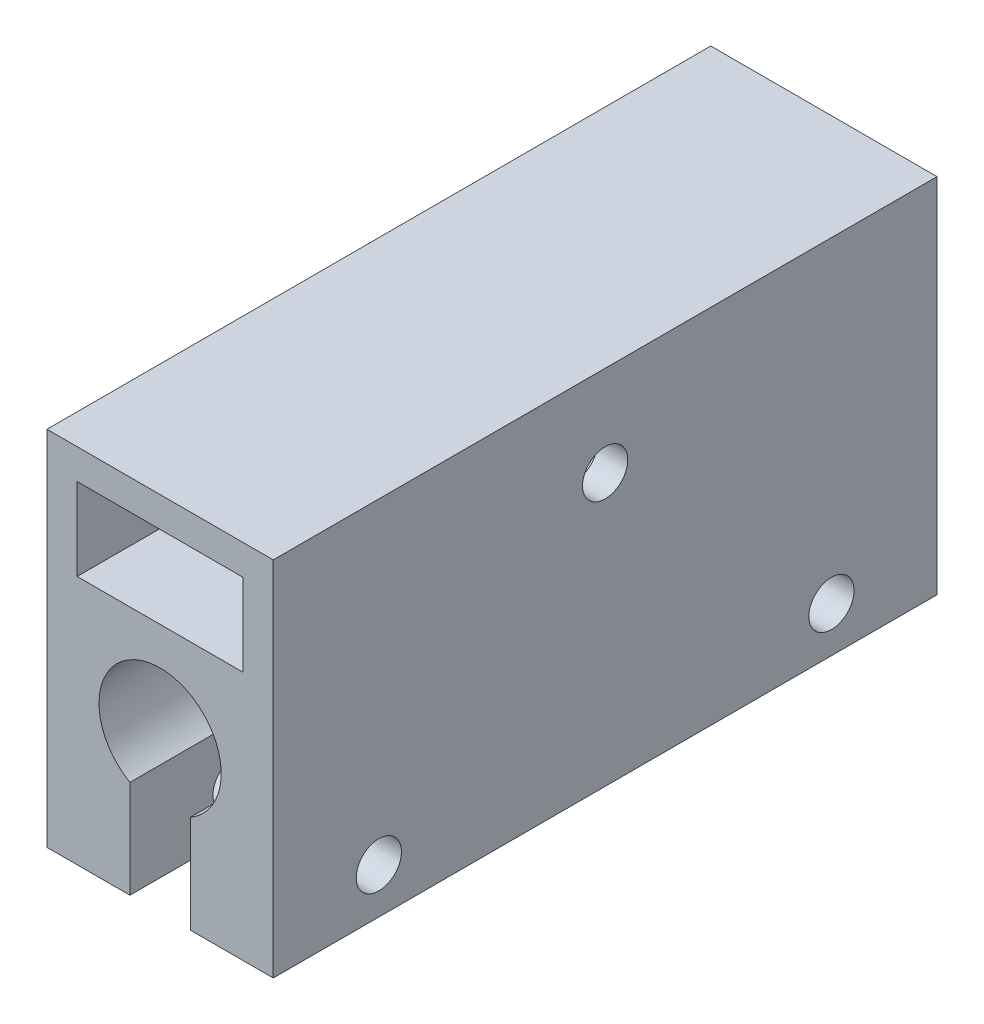
ISO-10303-21;
HEADER;
FILE_DESCRIPTION(('STEP AP214'),'2;1');
FILE_NAME('part.step','',(''),(''),'','','');
FILE_SCHEMA(('AUTOMOTIVE_DESIGN { 1 0 10303 214 1 1 1 1 }'));
ENDSEC;
DATA;
#1=APPLICATION_CONTEXT('core data for automotive mechanical design processes');
#2=APPLICATION_PROTOCOL_DEFINITION('international standard','automotive_design',2000,#1);
#3=PRODUCT_CONTEXT('',#1,'mechanical');
#4=PRODUCT('Part','Part','',(#3));
#5=PRODUCT_RELATED_PRODUCT_CATEGORY('part','',(#4));
#6=PRODUCT_DEFINITION_FORMATION('','',#4);
#7=PRODUCT_DEFINITION_CONTEXT('part definition',#1,'design');
#8=PRODUCT_DEFINITION('design','',#6,#7);
#9=PRODUCT_DEFINITION_SHAPE('','',#8);
#10=(LENGTH_UNIT() NAMED_UNIT(*) SI_UNIT(.MILLI.,.METRE.));
#11=(NAMED_UNIT(*) PLANE_ANGLE_UNIT() SI_UNIT($,.RADIAN.));
#12=(NAMED_UNIT(*) SI_UNIT($,.STERADIAN.) SOLID_ANGLE_UNIT());
#13=UNCERTAINTY_MEASURE_WITH_UNIT(LENGTH_MEASURE(1.E-05),#10,'distance_accuracy_value','');
#14=(GEOMETRIC_REPRESENTATION_CONTEXT(3) GLOBAL_UNCERTAINTY_ASSIGNED_CONTEXT((#13)) GLOBAL_UNIT_ASSIGNED_CONTEXT((#10,
#11,#12)) REPRESENTATION_CONTEXT('',''));
#15=CARTESIAN_POINT('',(0.,0.,0.));
#16=DIRECTION('',(0.,0.,1.));
#17=DIRECTION('',(1.,0.,0.));
#18=AXIS2_PLACEMENT_3D('',#15,#16,#17);
#19=CARTESIAN_POINT('',(-5.5,6.55,44.));
#20=DIRECTION('',(0.,1.,0.));
#21=DIRECTION('',(-1.,0.,0.));
#22=AXIS2_PLACEMENT_3D('',#19,#20,#21);
#23=PLANE('',#22);
#24=DIRECTION('',(-1.,0.,0.));
#25=VECTOR('',#24,1.);
#26=CARTESIAN_POINT('',(7.5,6.55,21.6159427126066));
#27=LINE('',#26,#25);
#28=CARTESIAN_POINT('',(5.5,6.55,21.6159427126066));
#29=VERTEX_POINT('',#28);
#30=CARTESIAN_POINT('',(-5.5,6.55,21.6159427126066));
#31=VERTEX_POINT('',#30);
#32=EDGE_CURVE('E11',#29,#31,#27,.T.);
#33=ORIENTED_EDGE('',*,*,#32,.F.);
#34=DIRECTION('',(0.,0.,-1.));
#35=VECTOR('',#34,1.);
#36=CARTESIAN_POINT('',(5.5,6.55,44.));
#37=LINE('',#36,#35);
#38=CARTESIAN_POINT('',(5.5,6.55,0.));
#39=VERTEX_POINT('',#38);
#40=EDGE_CURVE('E145',#29,#39,#37,.T.);
#41=ORIENTED_EDGE('',*,*,#40,.T.);
#42=DIRECTION('',(1.,0.,0.));
#43=VECTOR('',#42,1.);
#44=CARTESIAN_POINT('',(-5.5,6.55,0.));
#45=LINE('',#44,#43);
#46=CARTESIAN_POINT('',(-5.5,6.55,0.));
#47=VERTEX_POINT('',#46);
#48=EDGE_CURVE('E155',#47,#39,#45,.T.);
#49=ORIENTED_EDGE('',*,*,#48,.F.);
#50=DIRECTION('',(0.,0.,-1.));
#51=VECTOR('',#50,1.);
#52=CARTESIAN_POINT('',(-5.5,6.55,44.));
#53=LINE('',#52,#51);
#54=EDGE_CURVE('E151',#31,#47,#53,.T.);
#55=ORIENTED_EDGE('',*,*,#54,.F.);
#56=EDGE_LOOP('',(#33,#41,#49,#55));
#57=FACE_BOUND('',#56,.T.);
#58=ADVANCED_FACE('F34',(#57),#23,.T.);
#59=CARTESIAN_POINT('',(0.,0.,44.));
#60=DIRECTION('',(0.,0.,1.));
#61=DIRECTION('',(1.,0.,0.));
#62=AXIS2_PLACEMENT_3D('',#59,#60,#61);
#63=PLANE('',#62);
#64=DIRECTION('',(0.,-1.,0.));
#65=VECTOR('',#64,1.);
#66=CARTESIAN_POINT('',(-7.5,14.,44.));
#67=LINE('',#66,#65);
#68=CARTESIAN_POINT('',(-7.5,14.,44.));
#69=VERTEX_POINT('',#68);
#70=CARTESIAN_POINT('',(-7.5,-9.99999999999999,44.));
#71=VERTEX_POINT('',#70);
#72=EDGE_CURVE('E164',#69,#71,#67,.T.);
#73=ORIENTED_EDGE('',*,*,#72,.T.);
#74=DIRECTION('',(1.,0.,0.));
#75=VECTOR('',#74,1.);
#76=CARTESIAN_POINT('',(-7.5,-9.99999999999999,44.));
#77=LINE('',#76,#75);
#78=CARTESIAN_POINT('',(-2.,-10.,44.));
#79=VERTEX_POINT('',#78);
#80=EDGE_CURVE('E167',#71,#79,#77,.T.);
#81=ORIENTED_EDGE('',*,*,#80,.T.);
#82=DIRECTION('',(0.,1.,0.));
#83=VECTOR('',#82,1.);
#84=CARTESIAN_POINT('',(-2.,-3.52171833058807,44.));
#85=LINE('',#84,#83);
#86=CARTESIAN_POINT('',(-2.,-3.52171833058807,44.));
#87=VERTEX_POINT('',#86);
#88=EDGE_CURVE('E170',#79,#87,#85,.T.);
#89=ORIENTED_EDGE('',*,*,#88,.T.);
#90=CARTESIAN_POINT('',(0.,0.,44.));
#91=DIRECTION('',(0.,0.,-1.));
#92=DIRECTION('',(1.,0.,0.));
#93=AXIS2_PLACEMENT_3D('',#90,#91,#92);
#94=CIRCLE('',#93,4.05);
#95=CARTESIAN_POINT('',(2.,-3.52171833058807,44.));
#96=VERTEX_POINT('',#95);
#97=EDGE_CURVE('E172',#87,#96,#94,.T.);
#98=ORIENTED_EDGE('',*,*,#97,.T.);
#99=DIRECTION('',(0.,-1.,0.));
#100=VECTOR('',#99,1.);
#101=CARTESIAN_POINT('',(2.,-3.52171833058807,44.));
#102=LINE('',#101,#100);
#103=CARTESIAN_POINT('',(2.,-10.,44.));
#104=VERTEX_POINT('',#103);
#105=EDGE_CURVE('E174',#96,#104,#102,.T.);
#106=ORIENTED_EDGE('',*,*,#105,.T.);
#107=DIRECTION('',(1.,0.,0.));
#108=VECTOR('',#107,1.);
#109=CARTESIAN_POINT('',(2.,-10.,44.));
#110=LINE('',#109,#108);
#111=CARTESIAN_POINT('',(7.5,-9.99999999999999,44.));
#112=VERTEX_POINT('',#111);
#113=EDGE_CURVE('E176',#104,#112,#110,.T.);
#114=ORIENTED_EDGE('',*,*,#113,.T.);
#115=DIRECTION('',(0.,1.,0.));
#116=VECTOR('',#115,1.);
#117=CARTESIAN_POINT('',(7.5,14.,44.));
#118=LINE('',#117,#116);
#119=CARTESIAN_POINT('',(7.5,14.,44.));
#120=VERTEX_POINT('',#119);
#121=EDGE_CURVE('E178',#112,#120,#118,.T.);
#122=ORIENTED_EDGE('',*,*,#121,.T.);
#123=DIRECTION('',(-1.,0.,0.));
#124=VECTOR('',#123,1.);
#125=CARTESIAN_POINT('',(-7.5,14.,44.));
#126=LINE('',#125,#124);
#127=EDGE_CURVE('E180',#120,#69,#126,.T.);
#128=ORIENTED_EDGE('',*,*,#127,.T.);
#129=EDGE_LOOP('',(#73,#81,#89,#98,#106,#114,#122,#128));
#130=FACE_BOUND('',#129,.T.);
#131=DIRECTION('',(-1.,0.,0.));
#132=VECTOR('',#131,1.);
#133=CARTESIAN_POINT('',(-5.5,12.,44.));
#134=LINE('',#133,#132);
#135=CARTESIAN_POINT('',(5.5,12.,44.));
#136=VERTEX_POINT('',#135);
#137=CARTESIAN_POINT('',(-5.5,12.,44.));
#138=VERTEX_POINT('',#137);
#139=EDGE_CURVE('E341',#136,#138,#134,.T.);
#140=ORIENTED_EDGE('',*,*,#139,.F.);
#141=DIRECTION('',(0.,1.,0.));
#142=VECTOR('',#141,1.);
#143=CARTESIAN_POINT('',(5.5,12.,44.));
#144=LINE('',#143,#142);
#145=CARTESIAN_POINT('',(5.5,6.55,44.));
#146=VERTEX_POINT('',#145);
#147=EDGE_CURVE('E339',#146,#136,#144,.T.);
#148=ORIENTED_EDGE('',*,*,#147,.F.);
#149=DIRECTION('',(1.,0.,0.));
#150=VECTOR('',#149,1.);
#151=CARTESIAN_POINT('',(-5.5,6.55,44.));
#152=LINE('',#151,#150);
#153=CARTESIAN_POINT('',(-5.5,6.55,44.));
#154=VERTEX_POINT('',#153);
#155=EDGE_CURVE('E150',#154,#146,#152,.T.);
#156=ORIENTED_EDGE('',*,*,#155,.F.);
#157=DIRECTION('',(0.,-1.,0.));
#158=VECTOR('',#157,1.);
#159=CARTESIAN_POINT('',(-5.5,12.,44.));
#160=LINE('',#159,#158);
#161=EDGE_CURVE('E343',#138,#154,#160,.T.);
#162=ORIENTED_EDGE('',*,*,#161,.F.);
#163=EDGE_LOOP('',(#140,#148,#156,#162));
#164=FACE_BOUND('',#163,.T.);
#165=ADVANCED_FACE('F245',(#130,#164),#63,.T.);
#166=CARTESIAN_POINT('',(0.,0.,0.));
#167=DIRECTION('',(0.,0.,1.));
#168=DIRECTION('',(1.,0.,0.));
#169=AXIS2_PLACEMENT_3D('',#166,#167,#168);
#170=PLANE('',#169);
#171=DIRECTION('',(0.,-1.,0.));
#172=VECTOR('',#171,1.);
#173=CARTESIAN_POINT('',(-7.5,14.,0.));
#174=LINE('',#173,#172);
#175=CARTESIAN_POINT('',(-7.5,14.,0.));
#176=VERTEX_POINT('',#175);
#177=CARTESIAN_POINT('',(-7.5,-9.99999999999999,0.));
#178=VERTEX_POINT('',#177);
#179=EDGE_CURVE('E163',#176,#178,#174,.T.);
#180=ORIENTED_EDGE('',*,*,#179,.F.);
#181=DIRECTION('',(-1.,0.,0.));
#182=VECTOR('',#181,1.);
#183=CARTESIAN_POINT('',(-7.5,14.,0.));
#184=LINE('',#183,#182);
#185=CARTESIAN_POINT('',(7.5,14.,0.));
#186=VERTEX_POINT('',#185);
#187=EDGE_CURVE('E168',#186,#176,#184,.T.);
#188=ORIENTED_EDGE('',*,*,#187,.F.);
#189=DIRECTION('',(0.,1.,0.));
#190=VECTOR('',#189,1.);
#191=CARTESIAN_POINT('',(7.5,14.,0.));
#192=LINE('',#191,#190);
#193=CARTESIAN_POINT('',(7.5,-9.99999999999999,0.));
#194=VERTEX_POINT('',#193);
#195=EDGE_CURVE('E195',#194,#186,#192,.T.);
#196=ORIENTED_EDGE('',*,*,#195,.F.);
#197=DIRECTION('',(1.,0.,0.));
#198=VECTOR('',#197,1.);
#199=CARTESIAN_POINT('',(2.,-10.,0.));
#200=LINE('',#199,#198);
#201=CARTESIAN_POINT('',(2.,-10.,0.));
#202=VERTEX_POINT('',#201);
#203=EDGE_CURVE('E193',#202,#194,#200,.T.);
#204=ORIENTED_EDGE('',*,*,#203,.F.);
#205=DIRECTION('',(0.,-1.,0.));
#206=VECTOR('',#205,1.);
#207=CARTESIAN_POINT('',(2.,-3.52171833058807,0.));
#208=LINE('',#207,#206);
#209=CARTESIAN_POINT('',(2.,-3.52171833058807,0.));
#210=VERTEX_POINT('',#209);
#211=EDGE_CURVE('E191',#210,#202,#208,.T.);
#212=ORIENTED_EDGE('',*,*,#211,.F.);
#213=CARTESIAN_POINT('',(0.,0.,0.));
#214=DIRECTION('',(0.,0.,-1.));
#215=DIRECTION('',(1.,0.,0.));
#216=AXIS2_PLACEMENT_3D('',#213,#214,#215);
#217=CIRCLE('',#216,4.05);
#218=CARTESIAN_POINT('',(-2.,-3.52171833058807,0.));
#219=VERTEX_POINT('',#218);
#220=EDGE_CURVE('E189',#219,#210,#217,.T.);
#221=ORIENTED_EDGE('',*,*,#220,.F.);
#222=DIRECTION('',(0.,1.,0.));
#223=VECTOR('',#222,1.);
#224=CARTESIAN_POINT('',(-2.,-3.52171833058807,0.));
#225=LINE('',#224,#223);
#226=CARTESIAN_POINT('',(-2.,-10.,0.));
#227=VERTEX_POINT('',#226);
#228=EDGE_CURVE('E187',#227,#219,#225,.T.);
#229=ORIENTED_EDGE('',*,*,#228,.F.);
#230=DIRECTION('',(1.,0.,0.));
#231=VECTOR('',#230,1.);
#232=CARTESIAN_POINT('',(-7.5,-9.99999999999999,0.));
#233=LINE('',#232,#231);
#234=EDGE_CURVE('E185',#178,#227,#233,.T.);
#235=ORIENTED_EDGE('',*,*,#234,.F.);
#236=EDGE_LOOP('',(#180,#188,#196,#204,#212,#221,#229,#235));
#237=FACE_BOUND('',#236,.T.);
#238=DIRECTION('',(0.,1.,0.));
#239=VECTOR('',#238,1.);
#240=CARTESIAN_POINT('',(5.5,12.,0.));
#241=LINE('',#240,#239);
#242=CARTESIAN_POINT('',(5.5,12.,0.));
#243=VERTEX_POINT('',#242);
#244=EDGE_CURVE('E338',#39,#243,#241,.T.);
#245=ORIENTED_EDGE('',*,*,#244,.T.);
#246=DIRECTION('',(-1.,0.,0.));
#247=VECTOR('',#246,1.);
#248=CARTESIAN_POINT('',(-5.5,12.,0.));
#249=LINE('',#248,#247);
#250=CARTESIAN_POINT('',(-5.5,12.,0.));
#251=VERTEX_POINT('',#250);
#252=EDGE_CURVE('E348',#243,#251,#249,.T.);
#253=ORIENTED_EDGE('',*,*,#252,.T.);
#254=DIRECTION('',(0.,-1.,0.));
#255=VECTOR('',#254,1.);
#256=CARTESIAN_POINT('',(-5.5,12.,0.));
#257=LINE('',#256,#255);
#258=EDGE_CURVE('E350',#251,#47,#257,.T.);
#259=ORIENTED_EDGE('',*,*,#258,.T.);
#260=ORIENTED_EDGE('',*,*,#48,.T.);
#261=EDGE_LOOP('',(#245,#253,#259,#260));
#262=FACE_BOUND('',#261,.T.);
#263=ADVANCED_FACE('F229',(#237,#262),#170,.F.);
#264=CARTESIAN_POINT('',(-7.5,14.,44.));
#265=DIRECTION('',(1.,0.,0.));
#266=DIRECTION('',(0.,0.,-1.));
#267=AXIS2_PLACEMENT_3D('',#264,#265,#266);
#268=PLANE('',#267);
#269=CARTESIAN_POINT('',(-7.5,-6.99999999999999,7.));
#270=DIRECTION('',(-1.,0.,0.));
#271=DIRECTION('',(0.,0.,1.));
#272=AXIS2_PLACEMENT_3D('',#269,#270,#271);
#273=CIRCLE('',#272,1.5);
#274=CARTESIAN_POINT('',(-7.5,-6.99999999999999,8.5));
#275=VERTEX_POINT('',#274);
#276=EDGE_CURVE('E384',#275,#275,#273,.T.);
#277=ORIENTED_EDGE('',*,*,#276,.F.);
#278=EDGE_LOOP('',(#277));
#279=FACE_BOUND('',#278,.T.);
#280=CARTESIAN_POINT('',(-7.5,-6.99999999999999,37.));
#281=DIRECTION('',(-1.,0.,0.));
#282=DIRECTION('',(0.,0.,1.));
#283=AXIS2_PLACEMENT_3D('',#280,#281,#282);
#284=CIRCLE('',#283,1.5);
#285=CARTESIAN_POINT('',(-7.5,-6.99999999999999,38.5));
#286=VERTEX_POINT('',#285);
#287=EDGE_CURVE('E318',#286,#286,#284,.T.);
#288=ORIENTED_EDGE('',*,*,#287,.F.);
#289=EDGE_LOOP('',(#288));
#290=FACE_BOUND('',#289,.T.);
#291=CARTESIAN_POINT('',(-7.5,8.,22.));
#292=DIRECTION('',(-1.,0.,0.));
#293=DIRECTION('',(0.,0.,1.));
#294=AXIS2_PLACEMENT_3D('',#291,#292,#293);
#295=CIRCLE('',#294,1.5);
#296=CARTESIAN_POINT('',(-7.5,8.,23.5));
#297=VERTEX_POINT('',#296);
#298=EDGE_CURVE('E319',#297,#297,#295,.T.);
#299=ORIENTED_EDGE('',*,*,#298,.F.);
#300=EDGE_LOOP('',(#299));
#301=FACE_BOUND('',#300,.T.);
#302=ORIENTED_EDGE('',*,*,#179,.T.);
#303=DIRECTION('',(0.,0.,-1.));
#304=VECTOR('',#303,1.);
#305=CARTESIAN_POINT('',(-7.5,-9.99999999999999,44.));
#306=LINE('',#305,#304);
#307=EDGE_CURVE('E137',#71,#178,#306,.T.);
#308=ORIENTED_EDGE('',*,*,#307,.F.);
#309=ORIENTED_EDGE('',*,*,#72,.F.);
#310=DIRECTION('',(0.,0.,-1.));
#311=VECTOR('',#310,1.);
#312=CARTESIAN_POINT('',(-7.5,14.,44.));
#313=LINE('',#312,#311);
#314=EDGE_CURVE('E182',#69,#176,#313,.T.);
#315=ORIENTED_EDGE('',*,*,#314,.T.);
#316=EDGE_LOOP('',(#302,#308,#309,#315));
#317=FACE_BOUND('',#316,.T.);
#318=ADVANCED_FACE('F36',(#279,#290,#301,#317),#268,.F.);
#319=CARTESIAN_POINT('',(-7.5,-9.99999999999999,44.));
#320=DIRECTION('',(0.,1.,0.));
#321=DIRECTION('',(-1.,0.,0.));
#322=AXIS2_PLACEMENT_3D('',#319,#320,#321);
#323=PLANE('',#322);
#324=ORIENTED_EDGE('',*,*,#234,.T.);
#325=DIRECTION('',(0.,0.,-1.));
#326=VECTOR('',#325,1.);
#327=CARTESIAN_POINT('',(-2.,-10.,44.));
#328=LINE('',#327,#326);
#329=EDGE_CURVE('E215',#79,#227,#328,.T.);
#330=ORIENTED_EDGE('',*,*,#329,.F.);
#331=ORIENTED_EDGE('',*,*,#80,.F.);
#332=ORIENTED_EDGE('',*,*,#307,.T.);
#333=EDGE_LOOP('',(#324,#330,#331,#332));
#334=FACE_BOUND('',#333,.T.);
#335=ADVANCED_FACE('F221',(#334),#323,.F.);
#336=CARTESIAN_POINT('',(-2.,-3.52171833058807,44.));
#337=DIRECTION('',(-1.,0.,0.));
#338=DIRECTION('',(0.,-1.,0.));
#339=AXIS2_PLACEMENT_3D('',#336,#337,#338);
#340=PLANE('',#339);
#341=CARTESIAN_POINT('',(-2.,-6.99999999999999,7.));
#342=DIRECTION('',(-1.,0.,0.));
#343=DIRECTION('',(0.,-1.,0.));
#344=AXIS2_PLACEMENT_3D('',#341,#342,#343);
#345=CIRCLE('',#344,1.5);
#346=CARTESIAN_POINT('',(-2.,-8.49999999999999,7.));
#347=VERTEX_POINT('',#346);
#348=EDGE_CURVE('E335',#347,#347,#345,.T.);
#349=ORIENTED_EDGE('',*,*,#348,.T.);
#350=EDGE_LOOP('',(#349));
#351=FACE_BOUND('',#350,.T.);
#352=CARTESIAN_POINT('',(-2.,-6.99999999999999,37.));
#353=DIRECTION('',(-1.,0.,0.));
#354=DIRECTION('',(0.,-1.,0.));
#355=AXIS2_PLACEMENT_3D('',#352,#353,#354);
#356=CIRCLE('',#355,1.5);
#357=CARTESIAN_POINT('',(-2.,-8.5,37.));
#358=VERTEX_POINT('',#357);
#359=EDGE_CURVE('E330',#358,#358,#356,.T.);
#360=ORIENTED_EDGE('',*,*,#359,.T.);
#361=EDGE_LOOP('',(#360));
#362=FACE_BOUND('',#361,.T.);
#363=ORIENTED_EDGE('',*,*,#228,.T.);
#364=DIRECTION('',(0.,0.,-1.));
#365=VECTOR('',#364,1.);
#366=CARTESIAN_POINT('',(-2.,-3.52171833058807,44.));
#367=LINE('',#366,#365);
#368=EDGE_CURVE('E212',#87,#219,#367,.T.);
#369=ORIENTED_EDGE('',*,*,#368,.F.);
#370=ORIENTED_EDGE('',*,*,#88,.F.);
#371=ORIENTED_EDGE('',*,*,#329,.T.);
#372=EDGE_LOOP('',(#363,#369,#370,#371));
#373=FACE_BOUND('',#372,.T.);
#374=ADVANCED_FACE('F237',(#351,#362,#373),#340,.F.);
#375=CARTESIAN_POINT('',(0.,0.,44.));
#376=DIRECTION('',(0.,0.,-1.));
#377=DIRECTION('',(-1.,0.,0.));
#378=AXIS2_PLACEMENT_3D('',#375,#376,#377);
#379=CYLINDRICAL_SURFACE('',#378,4.05);
#380=ORIENTED_EDGE('',*,*,#220,.T.);
#381=DIRECTION('',(0.,0.,-1.));
#382=VECTOR('',#381,1.);
#383=CARTESIAN_POINT('',(2.,-3.52171833058807,44.));
#384=LINE('',#383,#382);
#385=EDGE_CURVE('E209',#96,#210,#384,.T.);
#386=ORIENTED_EDGE('',*,*,#385,.F.);
#387=ORIENTED_EDGE('',*,*,#97,.F.);
#388=ORIENTED_EDGE('',*,*,#368,.T.);
#389=EDGE_LOOP('',(#380,#386,#387,#388));
#390=FACE_BOUND('',#389,.T.);
#391=ADVANCED_FACE('F241',(#390),#379,.F.);
#392=CARTESIAN_POINT('',(2.,-3.52171833058807,44.));
#393=DIRECTION('',(1.,0.,0.));
#394=DIRECTION('',(0.,1.,0.));
#395=AXIS2_PLACEMENT_3D('',#392,#393,#394);
#396=PLANE('',#395);
#397=CARTESIAN_POINT('',(2.,-6.99999999999999,7.));
#398=DIRECTION('',(1.,0.,0.));
#399=DIRECTION('',(0.,1.,0.));
#400=AXIS2_PLACEMENT_3D('',#397,#398,#399);
#401=CIRCLE('',#400,1.5);
#402=CARTESIAN_POINT('',(2.,-5.49999999999999,7.));
#403=VERTEX_POINT('',#402);
#404=EDGE_CURVE('E333',#403,#403,#401,.T.);
#405=ORIENTED_EDGE('',*,*,#404,.T.);
#406=EDGE_LOOP('',(#405));
#407=FACE_BOUND('',#406,.T.);
#408=CARTESIAN_POINT('',(2.,-6.99999999999999,37.));
#409=DIRECTION('',(1.,0.,0.));
#410=DIRECTION('',(0.,1.,0.));
#411=AXIS2_PLACEMENT_3D('',#408,#409,#410);
#412=CIRCLE('',#411,1.5);
#413=CARTESIAN_POINT('',(2.,-5.49999999999999,37.));
#414=VERTEX_POINT('',#413);
#415=EDGE_CURVE('E146',#414,#414,#412,.T.);
#416=ORIENTED_EDGE('',*,*,#415,.T.);
#417=EDGE_LOOP('',(#416));
#418=FACE_BOUND('',#417,.T.);
#419=ORIENTED_EDGE('',*,*,#211,.T.);
#420=DIRECTION('',(0.,0.,-1.));
#421=VECTOR('',#420,1.);
#422=CARTESIAN_POINT('',(2.,-10.,44.));
#423=LINE('',#422,#421);
#424=EDGE_CURVE('E206',#104,#202,#423,.T.);
#425=ORIENTED_EDGE('',*,*,#424,.F.);
#426=ORIENTED_EDGE('',*,*,#105,.F.);
#427=ORIENTED_EDGE('',*,*,#385,.T.);
#428=EDGE_LOOP('',(#419,#425,#426,#427));
#429=FACE_BOUND('',#428,.T.);
#430=ADVANCED_FACE('F261',(#407,#418,#429),#396,.F.);
#431=CARTESIAN_POINT('',(2.,-10.,44.));
#432=DIRECTION('',(0.,1.,0.));
#433=DIRECTION('',(-1.,0.,0.));
#434=AXIS2_PLACEMENT_3D('',#431,#432,#433);
#435=PLANE('',#434);
#436=ORIENTED_EDGE('',*,*,#203,.T.);
#437=DIRECTION('',(0.,0.,-1.));
#438=VECTOR('',#437,1.);
#439=CARTESIAN_POINT('',(7.5,-9.99999999999999,44.));
#440=LINE('',#439,#438);
#441=EDGE_CURVE('E203',#112,#194,#440,.T.);
#442=ORIENTED_EDGE('',*,*,#441,.F.);
#443=ORIENTED_EDGE('',*,*,#113,.F.);
#444=ORIENTED_EDGE('',*,*,#424,.T.);
#445=EDGE_LOOP('',(#436,#442,#443,#444));
#446=FACE_BOUND('',#445,.T.);
#447=ADVANCED_FACE('F258',(#446),#435,.F.);
#448=CARTESIAN_POINT('',(7.5,14.,44.));
#449=DIRECTION('',(-1.,0.,0.));
#450=DIRECTION('',(0.,0.,1.));
#451=AXIS2_PLACEMENT_3D('',#448,#449,#450);
#452=PLANE('',#451);
#453=CARTESIAN_POINT('',(7.5,-6.99999999999999,7.));
#454=DIRECTION('',(-1.,0.,0.));
#455=DIRECTION('',(0.,0.,1.));
#456=AXIS2_PLACEMENT_3D('',#453,#454,#455);
#457=CIRCLE('',#456,1.5);
#458=CARTESIAN_POINT('',(7.5,-6.99999999999999,8.5));
#459=VERTEX_POINT('',#458);
#460=EDGE_CURVE('E310',#459,#459,#457,.T.);
#461=ORIENTED_EDGE('',*,*,#460,.T.);
#462=EDGE_LOOP('',(#461));
#463=FACE_BOUND('',#462,.T.);
#464=CARTESIAN_POINT('',(7.5,-6.99999999999999,37.));
#465=DIRECTION('',(-1.,0.,0.));
#466=DIRECTION('',(0.,0.,1.));
#467=AXIS2_PLACEMENT_3D('',#464,#465,#466);
#468=CIRCLE('',#467,1.5);
#469=CARTESIAN_POINT('',(7.5,-6.99999999999999,38.5));
#470=VERTEX_POINT('',#469);
#471=EDGE_CURVE('E314',#470,#470,#468,.T.);
#472=ORIENTED_EDGE('',*,*,#471,.T.);
#473=EDGE_LOOP('',(#472));
#474=FACE_BOUND('',#473,.T.);
#475=CARTESIAN_POINT('',(7.5,8.,22.));
#476=DIRECTION('',(-1.,0.,0.));
#477=DIRECTION('',(0.,0.,1.));
#478=AXIS2_PLACEMENT_3D('',#475,#476,#477);
#479=CIRCLE('',#478,1.5);
#480=CARTESIAN_POINT('',(7.5,8.,23.5));
#481=VERTEX_POINT('',#480);
#482=EDGE_CURVE('E317',#481,#481,#479,.T.);
#483=ORIENTED_EDGE('',*,*,#482,.T.);
#484=EDGE_LOOP('',(#483));
#485=FACE_BOUND('',#484,.T.);
#486=ORIENTED_EDGE('',*,*,#195,.T.);
#487=DIRECTION('',(0.,0.,-1.));
#488=VECTOR('',#487,1.);
#489=CARTESIAN_POINT('',(7.5,14.,44.));
#490=LINE('',#489,#488);
#491=EDGE_CURVE('E200',#120,#186,#490,.T.);
#492=ORIENTED_EDGE('',*,*,#491,.F.);
#493=ORIENTED_EDGE('',*,*,#121,.F.);
#494=ORIENTED_EDGE('',*,*,#441,.T.);
#495=EDGE_LOOP('',(#486,#492,#493,#494));
#496=FACE_BOUND('',#495,.T.);
#497=ADVANCED_FACE('F254',(#463,#474,#485,#496),#452,.F.);
#498=CARTESIAN_POINT('',(-7.5,14.,44.));
#499=DIRECTION('',(0.,-1.,0.));
#500=DIRECTION('',(0.,0.,-1.));
#501=AXIS2_PLACEMENT_3D('',#498,#499,#500);
#502=PLANE('',#501);
#503=ORIENTED_EDGE('',*,*,#187,.T.);
#504=ORIENTED_EDGE('',*,*,#314,.F.);
#505=ORIENTED_EDGE('',*,*,#127,.F.);
#506=ORIENTED_EDGE('',*,*,#491,.T.);
#507=EDGE_LOOP('',(#503,#504,#505,#506));
#508=FACE_BOUND('',#507,.T.);
#509=ADVANCED_FACE('F252',(#508),#502,.F.);
#510=CARTESIAN_POINT('',(5.5,12.,44.));
#511=DIRECTION('',(-1.,0.,0.));
#512=DIRECTION('',(0.,0.,1.));
#513=AXIS2_PLACEMENT_3D('',#510,#511,#512);
#514=PLANE('',#513);
#515=CARTESIAN_POINT('',(5.5,8.,22.));
#516=DIRECTION('',(-1.,0.,0.));
#517=DIRECTION('',(0.,0.,1.));
#518=AXIS2_PLACEMENT_3D('',#515,#516,#517);
#519=CIRCLE('',#518,1.5);
#520=CARTESIAN_POINT('',(5.5,6.55,22.3840572873934));
#521=VERTEX_POINT('',#520);
#522=EDGE_CURVE('E134',#521,#29,#519,.T.);
#523=ORIENTED_EDGE('',*,*,#522,.F.);
#524=EDGE_CURVE('E142',#146,#521,#37,.T.);
#525=ORIENTED_EDGE('',*,*,#524,.F.);
#526=ORIENTED_EDGE('',*,*,#147,.T.);
#527=DIRECTION('',(0.,0.,-1.));
#528=VECTOR('',#527,1.);
#529=CARTESIAN_POINT('',(5.5,12.,44.));
#530=LINE('',#529,#528);
#531=EDGE_CURVE('E160',#136,#243,#530,.T.);
#532=ORIENTED_EDGE('',*,*,#531,.T.);
#533=ORIENTED_EDGE('',*,*,#244,.F.);
#534=ORIENTED_EDGE('',*,*,#40,.F.);
#535=EDGE_LOOP('',(#523,#525,#526,#532,#533,#534));
#536=FACE_BOUND('',#535,.T.);
#537=ADVANCED_FACE('F141',(#536),#514,.T.);
#538=CARTESIAN_POINT('',(-5.5,12.,44.));
#539=DIRECTION('',(0.,-1.,0.));
#540=DIRECTION('',(0.,0.,-1.));
#541=AXIS2_PLACEMENT_3D('',#538,#539,#540);
#542=PLANE('',#541);
#543=ORIENTED_EDGE('',*,*,#252,.F.);
#544=ORIENTED_EDGE('',*,*,#531,.F.);
#545=ORIENTED_EDGE('',*,*,#139,.T.);
#546=DIRECTION('',(0.,0.,-1.));
#547=VECTOR('',#546,1.);
#548=CARTESIAN_POINT('',(-5.5,12.,44.));
#549=LINE('',#548,#547);
#550=EDGE_CURVE('E158',#138,#251,#549,.T.);
#551=ORIENTED_EDGE('',*,*,#550,.T.);
#552=EDGE_LOOP('',(#543,#544,#545,#551));
#553=FACE_BOUND('',#552,.T.);
#554=ADVANCED_FACE('F289',(#553),#542,.T.);
#555=CARTESIAN_POINT('',(-5.5,12.,44.));
#556=DIRECTION('',(1.,0.,0.));
#557=DIRECTION('',(0.,0.,-1.));
#558=AXIS2_PLACEMENT_3D('',#555,#556,#557);
#559=PLANE('',#558);
#560=CARTESIAN_POINT('',(-5.5,8.,22.));
#561=DIRECTION('',(1.,0.,0.));
#562=DIRECTION('',(0.,0.,-1.));
#563=AXIS2_PLACEMENT_3D('',#560,#561,#562);
#564=CIRCLE('',#563,1.5);
#565=CARTESIAN_POINT('',(-5.5,6.55,22.3840572873934));
#566=VERTEX_POINT('',#565);
#567=EDGE_CURVE('E48',#31,#566,#564,.T.);
#568=ORIENTED_EDGE('',*,*,#567,.F.);
#569=ORIENTED_EDGE('',*,*,#54,.T.);
#570=ORIENTED_EDGE('',*,*,#258,.F.);
#571=ORIENTED_EDGE('',*,*,#550,.F.);
#572=ORIENTED_EDGE('',*,*,#161,.T.);
#573=EDGE_CURVE('E55',#154,#566,#53,.T.);
#574=ORIENTED_EDGE('',*,*,#573,.T.);
#575=EDGE_LOOP('',(#568,#569,#570,#571,#572,#574));
#576=FACE_BOUND('',#575,.T.);
#577=ADVANCED_FACE('F283',(#576),#559,.T.);
#578=DIRECTION('',(-1.,0.,0.));
#579=VECTOR('',#578,1.);
#580=CARTESIAN_POINT('',(7.5,6.55,22.3840572873934));
#581=LINE('',#580,#579);
#582=EDGE_CURVE('E42',#566,#521,#581,.F.);
#583=ORIENTED_EDGE('',*,*,#582,.F.);
#584=ORIENTED_EDGE('',*,*,#573,.F.);
#585=ORIENTED_EDGE('',*,*,#155,.T.);
#586=ORIENTED_EDGE('',*,*,#524,.T.);
#587=EDGE_LOOP('',(#583,#584,#585,#586));
#588=FACE_BOUND('',#587,.T.);
#589=ADVANCED_FACE('F148',(#588),#23,.T.);
#590=CARTESIAN_POINT('',(7.5,8.,22.));
#591=DIRECTION('',(-1.,0.,0.));
#592=DIRECTION('',(0.,0.,1.));
#593=AXIS2_PLACEMENT_3D('',#590,#591,#592);
#594=CYLINDRICAL_SURFACE('',#593,1.5);
#595=ORIENTED_EDGE('',*,*,#32,.T.);
#596=ORIENTED_EDGE('',*,*,#567,.T.);
#597=ORIENTED_EDGE('',*,*,#582,.T.);
#598=ORIENTED_EDGE('',*,*,#522,.T.);
#599=EDGE_LOOP('',(#595,#596,#597,#598));
#600=FACE_BOUND('',#599,.T.);
#601=ORIENTED_EDGE('',*,*,#482,.F.);
#602=EDGE_LOOP('',(#601));
#603=FACE_BOUND('',#602,.T.);
#604=ORIENTED_EDGE('',*,*,#298,.T.);
#605=EDGE_LOOP('',(#604));
#606=FACE_BOUND('',#605,.T.);
#607=ADVANCED_FACE('F132',(#600,#603,#606),#594,.F.);
#608=CARTESIAN_POINT('',(7.5,-6.99999999999999,37.));
#609=DIRECTION('',(-1.,0.,0.));
#610=DIRECTION('',(0.,0.,1.));
#611=AXIS2_PLACEMENT_3D('',#608,#609,#610);
#612=CYLINDRICAL_SURFACE('',#611,1.5);
#613=ORIENTED_EDGE('',*,*,#471,.F.);
#614=EDGE_LOOP('',(#613));
#615=FACE_BOUND('',#614,.T.);
#616=ORIENTED_EDGE('',*,*,#415,.F.);
#617=EDGE_LOOP('',(#616));
#618=FACE_BOUND('',#617,.T.);
#619=ADVANCED_FACE('F288',(#615,#618),#612,.F.);
#620=CARTESIAN_POINT('',(7.5,-6.99999999999999,7.));
#621=DIRECTION('',(-1.,0.,0.));
#622=DIRECTION('',(0.,0.,1.));
#623=AXIS2_PLACEMENT_3D('',#620,#621,#622);
#624=CYLINDRICAL_SURFACE('',#623,1.5);
#625=ORIENTED_EDGE('',*,*,#460,.F.);
#626=EDGE_LOOP('',(#625));
#627=FACE_BOUND('',#626,.T.);
#628=ORIENTED_EDGE('',*,*,#404,.F.);
#629=EDGE_LOOP('',(#628));
#630=FACE_BOUND('',#629,.T.);
#631=ADVANCED_FACE('F369',(#627,#630),#624,.F.);
#632=ORIENTED_EDGE('',*,*,#287,.T.);
#633=EDGE_LOOP('',(#632));
#634=FACE_BOUND('',#633,.T.);
#635=ORIENTED_EDGE('',*,*,#359,.F.);
#636=EDGE_LOOP('',(#635));
#637=FACE_BOUND('',#636,.T.);
#638=ADVANCED_FACE('F366',(#634,#637),#612,.F.);
#639=ORIENTED_EDGE('',*,*,#276,.T.);
#640=EDGE_LOOP('',(#639));
#641=FACE_BOUND('',#640,.T.);
#642=ORIENTED_EDGE('',*,*,#348,.F.);
#643=EDGE_LOOP('',(#642));
#644=FACE_BOUND('',#643,.T.);
#645=ADVANCED_FACE('F364',(#641,#644),#624,.F.);
#646=CLOSED_SHELL('',(#58,#165,#263,#318,#335,#374,#391,#430,#447,#497,#509,#537,#554,#577,#589,
#607,#619,#631,#638,#645));
#647=MANIFOLD_SOLID_BREP('B2',#646);
#648=ADVANCED_BREP_SHAPE_REPRESENTATION('',(#18,#647),#14);
#649=SHAPE_DEFINITION_REPRESENTATION(#9,#648);
ENDSEC;
END-ISO-10303-21;
